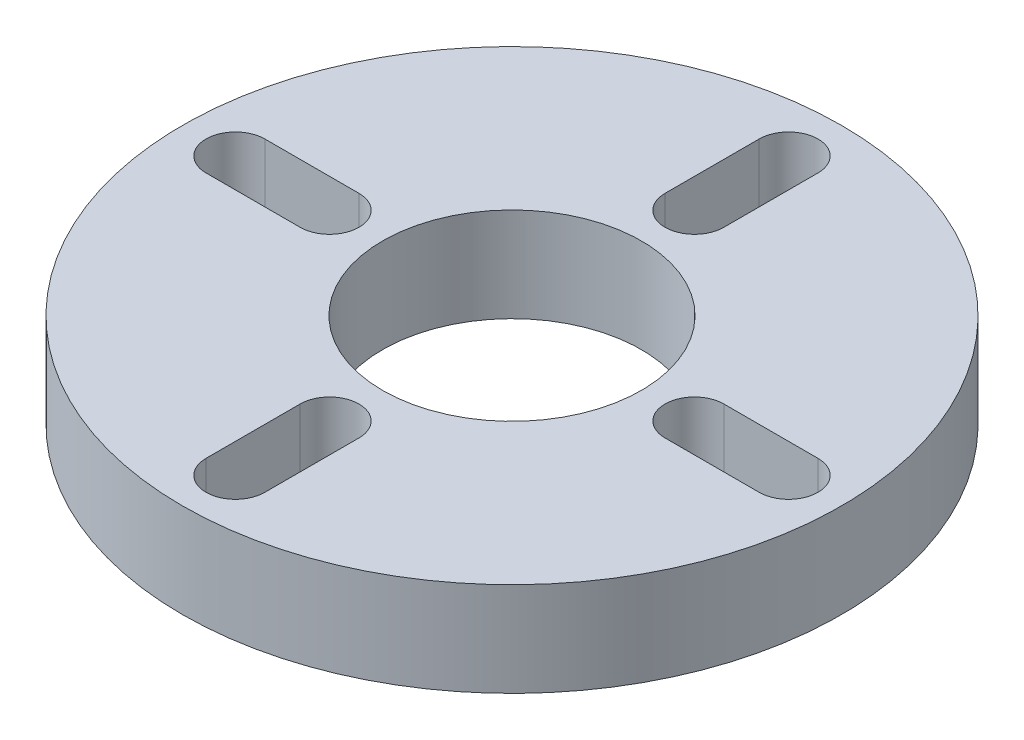
ISO-10303-21;
HEADER;
FILE_DESCRIPTION(('STEP AP214'),'2;1');
FILE_NAME('part.step','',(''),(''),'','','');
FILE_SCHEMA(('AUTOMOTIVE_DESIGN { 1 0 10303 214 1 1 1 1 }'));
ENDSEC;
DATA;
#1=APPLICATION_CONTEXT('core data for automotive mechanical design processes');
#2=APPLICATION_PROTOCOL_DEFINITION('international standard','automotive_design',2000,#1);
#3=PRODUCT_CONTEXT('',#1,'mechanical');
#4=PRODUCT('Part','Part','',(#3));
#5=PRODUCT_RELATED_PRODUCT_CATEGORY('part','',(#4));
#6=PRODUCT_DEFINITION_FORMATION('','',#4);
#7=PRODUCT_DEFINITION_CONTEXT('part definition',#1,'design');
#8=PRODUCT_DEFINITION('design','',#6,#7);
#9=PRODUCT_DEFINITION_SHAPE('','',#8);
#10=(LENGTH_UNIT() NAMED_UNIT(*) SI_UNIT(.MILLI.,.METRE.));
#11=(NAMED_UNIT(*) PLANE_ANGLE_UNIT() SI_UNIT($,.RADIAN.));
#12=(NAMED_UNIT(*) SI_UNIT($,.STERADIAN.) SOLID_ANGLE_UNIT());
#13=UNCERTAINTY_MEASURE_WITH_UNIT(LENGTH_MEASURE(1.E-05),#10,'distance_accuracy_value','');
#14=(GEOMETRIC_REPRESENTATION_CONTEXT(3) GLOBAL_UNCERTAINTY_ASSIGNED_CONTEXT((#13)) GLOBAL_UNIT_ASSIGNED_CONTEXT((#10,
#11,#12)) REPRESENTATION_CONTEXT('',''));
#15=CARTESIAN_POINT('',(0.,0.,0.));
#16=DIRECTION('',(0.,0.,1.));
#17=DIRECTION('',(1.,0.,0.));
#18=AXIS2_PLACEMENT_3D('',#15,#16,#17);
#19=CARTESIAN_POINT('',(0.,4.,0.));
#20=DIRECTION('',(0.,-1.,0.));
#21=DIRECTION('',(0.,0.,-1.));
#22=AXIS2_PLACEMENT_3D('',#19,#20,#21);
#23=CYLINDRICAL_SURFACE('',#22,14.);
#24=CARTESIAN_POINT('',(0.,4.,0.));
#25=DIRECTION('',(0.,1.,0.));
#26=DIRECTION('',(0.,0.,1.));
#27=AXIS2_PLACEMENT_3D('',#24,#25,#26);
#28=CIRCLE('',#27,14.);
#29=CARTESIAN_POINT('',(0.,4.,14.));
#30=VERTEX_POINT('',#29);
#31=EDGE_CURVE('E11',#30,#30,#28,.T.);
#32=ORIENTED_EDGE('',*,*,#31,.F.);
#33=EDGE_LOOP('',(#32));
#34=FACE_BOUND('',#33,.T.);
#35=CARTESIAN_POINT('',(0.,0.,0.));
#36=DIRECTION('',(0.,1.,0.));
#37=DIRECTION('',(0.,0.,1.));
#38=AXIS2_PLACEMENT_3D('',#35,#36,#37);
#39=CIRCLE('',#38,14.);
#40=CARTESIAN_POINT('',(0.,0.,14.));
#41=VERTEX_POINT('',#40);
#42=EDGE_CURVE('E36',#41,#41,#39,.T.);
#43=ORIENTED_EDGE('',*,*,#42,.T.);
#44=EDGE_LOOP('',(#43));
#45=FACE_BOUND('',#44,.T.);
#46=ADVANCED_FACE('F33',(#34,#45),#23,.T.);
#47=CARTESIAN_POINT('',(0.,4.,0.));
#48=DIRECTION('',(0.,1.,0.));
#49=DIRECTION('',(0.,0.,1.));
#50=AXIS2_PLACEMENT_3D('',#47,#48,#49);
#51=PLANE('',#50);
#52=CARTESIAN_POINT('',(-11.75,4.,0.));
#53=DIRECTION('',(0.,1.,0.));
#54=DIRECTION('',(0.,0.,1.));
#55=AXIS2_PLACEMENT_3D('',#52,#53,#54);
#56=CIRCLE('',#55,1.25);
#57=CARTESIAN_POINT('',(-11.75,4.,-1.25));
#58=VERTEX_POINT('',#57);
#59=CARTESIAN_POINT('',(-11.75,4.,1.25));
#60=VERTEX_POINT('',#59);
#61=EDGE_CURVE('E47',#58,#60,#56,.T.);
#62=ORIENTED_EDGE('',*,*,#61,.F.);
#63=DIRECTION('',(-1.,0.,0.));
#64=VECTOR('',#63,1.);
#65=CARTESIAN_POINT('',(-11.75,4.,-1.25));
#66=LINE('',#65,#64);
#67=CARTESIAN_POINT('',(-7.75,4.,-1.25));
#68=VERTEX_POINT('',#67);
#69=EDGE_CURVE('E166',#68,#58,#66,.T.);
#70=ORIENTED_EDGE('',*,*,#69,.F.);
#71=CARTESIAN_POINT('',(-7.75,4.,0.));
#72=DIRECTION('',(0.,1.,0.));
#73=DIRECTION('',(0.,0.,1.));
#74=AXIS2_PLACEMENT_3D('',#71,#72,#73);
#75=CIRCLE('',#74,1.25);
#76=CARTESIAN_POINT('',(-7.75,4.,1.25));
#77=VERTEX_POINT('',#76);
#78=EDGE_CURVE('E169',#77,#68,#75,.T.);
#79=ORIENTED_EDGE('',*,*,#78,.F.);
#80=DIRECTION('',(1.,0.,0.));
#81=VECTOR('',#80,1.);
#82=CARTESIAN_POINT('',(-11.75,4.,1.25));
#83=LINE('',#82,#81);
#84=EDGE_CURVE('E175',#60,#77,#83,.T.);
#85=ORIENTED_EDGE('',*,*,#84,.F.);
#86=EDGE_LOOP('',(#62,#70,#79,#85));
#87=FACE_BOUND('',#86,.T.);
#88=CARTESIAN_POINT('',(0.,4.,-11.75));
#89=DIRECTION('',(0.,1.,0.));
#90=DIRECTION('',(0.,0.,1.));
#91=AXIS2_PLACEMENT_3D('',#88,#89,#90);
#92=CIRCLE('',#91,1.25);
#93=CARTESIAN_POINT('',(1.25000000000004,4.,-11.75));
#94=VERTEX_POINT('',#93);
#95=CARTESIAN_POINT('',(-1.24999999999996,4.,-11.75));
#96=VERTEX_POINT('',#95);
#97=EDGE_CURVE('E55',#94,#96,#92,.T.);
#98=ORIENTED_EDGE('',*,*,#97,.F.);
#99=DIRECTION('',(0.,0.,-1.));
#100=VECTOR('',#99,1.);
#101=CARTESIAN_POINT('',(1.25000000000004,4.,-11.75));
#102=LINE('',#101,#100);
#103=CARTESIAN_POINT('',(1.25000000000003,4.,-7.75));
#104=VERTEX_POINT('',#103);
#105=EDGE_CURVE('E190',#104,#94,#102,.T.);
#106=ORIENTED_EDGE('',*,*,#105,.F.);
#107=CARTESIAN_POINT('',(0.,4.,-7.75));
#108=DIRECTION('',(0.,1.,0.));
#109=DIRECTION('',(0.,0.,1.));
#110=AXIS2_PLACEMENT_3D('',#107,#108,#109);
#111=CIRCLE('',#110,1.25);
#112=CARTESIAN_POINT('',(-1.24999999999997,4.,-7.75));
#113=VERTEX_POINT('',#112);
#114=EDGE_CURVE('E205',#113,#104,#111,.T.);
#115=ORIENTED_EDGE('',*,*,#114,.F.);
#116=DIRECTION('',(0.,0.,1.));
#117=VECTOR('',#116,1.);
#118=CARTESIAN_POINT('',(-1.24999999999996,4.,-11.75));
#119=LINE('',#118,#117);
#120=EDGE_CURVE('E201',#96,#113,#119,.T.);
#121=ORIENTED_EDGE('',*,*,#120,.F.);
#122=EDGE_LOOP('',(#98,#106,#115,#121));
#123=FACE_BOUND('',#122,.T.);
#124=CARTESIAN_POINT('',(11.75,4.,0.));
#125=DIRECTION('',(0.,1.,0.));
#126=DIRECTION('',(0.,0.,1.));
#127=AXIS2_PLACEMENT_3D('',#124,#125,#126);
#128=CIRCLE('',#127,1.25);
#129=CARTESIAN_POINT('',(11.75,4.,1.25000000000008));
#130=VERTEX_POINT('',#129);
#131=CARTESIAN_POINT('',(11.75,4.,-1.24999999999992));
#132=VERTEX_POINT('',#131);
#133=EDGE_CURVE('E230',#130,#132,#128,.T.);
#134=ORIENTED_EDGE('',*,*,#133,.F.);
#135=DIRECTION('',(1.,0.,0.));
#136=VECTOR('',#135,1.);
#137=CARTESIAN_POINT('',(11.75,4.,1.25000000000008));
#138=LINE('',#137,#136);
#139=CARTESIAN_POINT('',(7.74999999999999,4.,1.25000000000006));
#140=VERTEX_POINT('',#139);
#141=EDGE_CURVE('E220',#140,#130,#138,.T.);
#142=ORIENTED_EDGE('',*,*,#141,.F.);
#143=CARTESIAN_POINT('',(7.75,4.,0.));
#144=DIRECTION('',(0.,1.,0.));
#145=DIRECTION('',(0.,0.,1.));
#146=AXIS2_PLACEMENT_3D('',#143,#144,#145);
#147=CIRCLE('',#146,1.25);
#148=CARTESIAN_POINT('',(7.75000000000001,4.,-1.24999999999995));
#149=VERTEX_POINT('',#148);
#150=EDGE_CURVE('E236',#149,#140,#147,.T.);
#151=ORIENTED_EDGE('',*,*,#150,.F.);
#152=DIRECTION('',(-1.,0.,0.));
#153=VECTOR('',#152,1.);
#154=CARTESIAN_POINT('',(11.75,4.,-1.24999999999992));
#155=LINE('',#154,#153);
#156=EDGE_CURVE('E232',#132,#149,#155,.T.);
#157=ORIENTED_EDGE('',*,*,#156,.F.);
#158=EDGE_LOOP('',(#134,#142,#151,#157));
#159=FACE_BOUND('',#158,.T.);
#160=CARTESIAN_POINT('',(-1.22207355456232E-13,4.,11.75));
#161=DIRECTION('',(0.,1.,0.));
#162=DIRECTION('',(0.,0.,1.));
#163=AXIS2_PLACEMENT_3D('',#160,#161,#162);
#164=CIRCLE('',#163,1.25);
#165=CARTESIAN_POINT('',(-1.25000000000012,4.,11.75));
#166=VERTEX_POINT('',#165);
#167=CARTESIAN_POINT('',(1.24999999999988,4.,11.75));
#168=VERTEX_POINT('',#167);
#169=EDGE_CURVE('E262',#166,#168,#164,.T.);
#170=ORIENTED_EDGE('',*,*,#169,.F.);
#171=DIRECTION('',(0.,0.,1.));
#172=VECTOR('',#171,1.);
#173=CARTESIAN_POINT('',(-1.25000000000012,4.,11.75));
#174=LINE('',#173,#172);
#175=CARTESIAN_POINT('',(-1.25000000000008,4.,7.74999999999999));
#176=VERTEX_POINT('',#175);
#177=EDGE_CURVE('E252',#176,#166,#174,.T.);
#178=ORIENTED_EDGE('',*,*,#177,.F.);
#179=CARTESIAN_POINT('',(0.,4.,7.75));
#180=DIRECTION('',(0.,1.,0.));
#181=DIRECTION('',(0.,0.,1.));
#182=AXIS2_PLACEMENT_3D('',#179,#180,#181);
#183=CIRCLE('',#182,1.25);
#184=CARTESIAN_POINT('',(1.24999999999992,4.,7.75000000000001));
#185=VERTEX_POINT('',#184);
#186=EDGE_CURVE('E267',#185,#176,#183,.T.);
#187=ORIENTED_EDGE('',*,*,#186,.F.);
#188=DIRECTION('',(0.,0.,-1.));
#189=VECTOR('',#188,1.);
#190=CARTESIAN_POINT('',(1.24999999999988,4.,11.75));
#191=LINE('',#190,#189);
#192=EDGE_CURVE('E264',#168,#185,#191,.T.);
#193=ORIENTED_EDGE('',*,*,#192,.F.);
#194=EDGE_LOOP('',(#170,#178,#187,#193));
#195=FACE_BOUND('',#194,.T.);
#196=CARTESIAN_POINT('',(0.,4.,0.));
#197=DIRECTION('',(0.,1.,0.));
#198=DIRECTION('',(0.,0.,1.));
#199=AXIS2_PLACEMENT_3D('',#196,#197,#198);
#200=CIRCLE('',#199,5.5);
#201=CARTESIAN_POINT('',(0.,4.,5.5));
#202=VERTEX_POINT('',#201);
#203=EDGE_CURVE('E182',#202,#202,#200,.T.);
#204=ORIENTED_EDGE('',*,*,#203,.F.);
#205=EDGE_LOOP('',(#204));
#206=FACE_BOUND('',#205,.T.);
#207=ORIENTED_EDGE('',*,*,#31,.T.);
#208=EDGE_LOOP('',(#207));
#209=FACE_BOUND('',#208,.T.);
#210=ADVANCED_FACE('F287',(#87,#123,#159,#195,#206,#209),#51,.T.);
#211=CARTESIAN_POINT('',(0.,0.,0.));
#212=DIRECTION('',(0.,1.,0.));
#213=DIRECTION('',(0.,0.,1.));
#214=AXIS2_PLACEMENT_3D('',#211,#212,#213);
#215=PLANE('',#214);
#216=DIRECTION('',(-1.,0.,0.));
#217=VECTOR('',#216,1.);
#218=CARTESIAN_POINT('',(-11.75,0.,-1.25));
#219=LINE('',#218,#217);
#220=CARTESIAN_POINT('',(-7.75,0.,-1.25));
#221=VERTEX_POINT('',#220);
#222=CARTESIAN_POINT('',(-11.75,0.,-1.25));
#223=VERTEX_POINT('',#222);
#224=EDGE_CURVE('E153',#221,#223,#219,.T.);
#225=ORIENTED_EDGE('',*,*,#224,.T.);
#226=CARTESIAN_POINT('',(-11.75,0.,0.));
#227=DIRECTION('',(0.,1.,0.));
#228=DIRECTION('',(0.,0.,1.));
#229=AXIS2_PLACEMENT_3D('',#226,#227,#228);
#230=CIRCLE('',#229,1.25);
#231=CARTESIAN_POINT('',(-11.75,0.,1.25));
#232=VERTEX_POINT('',#231);
#233=EDGE_CURVE('E147',#223,#232,#230,.T.);
#234=ORIENTED_EDGE('',*,*,#233,.T.);
#235=DIRECTION('',(1.,0.,0.));
#236=VECTOR('',#235,1.);
#237=CARTESIAN_POINT('',(-11.75,0.,1.25));
#238=LINE('',#237,#236);
#239=CARTESIAN_POINT('',(-7.75,0.,1.25));
#240=VERTEX_POINT('',#239);
#241=EDGE_CURVE('E157',#232,#240,#238,.T.);
#242=ORIENTED_EDGE('',*,*,#241,.T.);
#243=CARTESIAN_POINT('',(-7.75,0.,0.));
#244=DIRECTION('',(0.,1.,0.));
#245=DIRECTION('',(0.,0.,1.));
#246=AXIS2_PLACEMENT_3D('',#243,#244,#245);
#247=CIRCLE('',#246,1.25);
#248=EDGE_CURVE('E161',#240,#221,#247,.T.);
#249=ORIENTED_EDGE('',*,*,#248,.T.);
#250=EDGE_LOOP('',(#225,#234,#242,#249));
#251=FACE_BOUND('',#250,.T.);
#252=DIRECTION('',(0.,0.,-1.));
#253=VECTOR('',#252,1.);
#254=CARTESIAN_POINT('',(1.25000000000004,0.,-11.75));
#255=LINE('',#254,#253);
#256=CARTESIAN_POINT('',(1.25000000000003,0.,-7.75));
#257=VERTEX_POINT('',#256);
#258=CARTESIAN_POINT('',(1.25000000000004,0.,-11.75));
#259=VERTEX_POINT('',#258);
#260=EDGE_CURVE('E196',#257,#259,#255,.T.);
#261=ORIENTED_EDGE('',*,*,#260,.T.);
#262=CARTESIAN_POINT('',(0.,0.,-11.75));
#263=DIRECTION('',(0.,1.,0.));
#264=DIRECTION('',(0.,0.,1.));
#265=AXIS2_PLACEMENT_3D('',#262,#263,#264);
#266=CIRCLE('',#265,1.25);
#267=CARTESIAN_POINT('',(-1.24999999999996,0.,-11.75));
#268=VERTEX_POINT('',#267);
#269=EDGE_CURVE('E186',#259,#268,#266,.T.);
#270=ORIENTED_EDGE('',*,*,#269,.T.);
#271=DIRECTION('',(0.,0.,1.));
#272=VECTOR('',#271,1.);
#273=CARTESIAN_POINT('',(-1.24999999999996,0.,-11.75));
#274=LINE('',#273,#272);
#275=CARTESIAN_POINT('',(-1.24999999999997,0.,-7.75));
#276=VERTEX_POINT('',#275);
#277=EDGE_CURVE('E189',#268,#276,#274,.T.);
#278=ORIENTED_EDGE('',*,*,#277,.T.);
#279=CARTESIAN_POINT('',(0.,0.,-7.75));
#280=DIRECTION('',(0.,1.,0.));
#281=DIRECTION('',(0.,0.,1.));
#282=AXIS2_PLACEMENT_3D('',#279,#280,#281);
#283=CIRCLE('',#282,1.25);
#284=EDGE_CURVE('E193',#276,#257,#283,.T.);
#285=ORIENTED_EDGE('',*,*,#284,.T.);
#286=EDGE_LOOP('',(#261,#270,#278,#285));
#287=FACE_BOUND('',#286,.T.);
#288=DIRECTION('',(1.,0.,0.));
#289=VECTOR('',#288,1.);
#290=CARTESIAN_POINT('',(11.75,0.,1.25000000000008));
#291=LINE('',#290,#289);
#292=CARTESIAN_POINT('',(7.74999999999999,0.,1.25000000000006));
#293=VERTEX_POINT('',#292);
#294=CARTESIAN_POINT('',(11.75,0.,1.25000000000008));
#295=VERTEX_POINT('',#294);
#296=EDGE_CURVE('E226',#293,#295,#291,.T.);
#297=ORIENTED_EDGE('',*,*,#296,.T.);
#298=CARTESIAN_POINT('',(11.75,0.,0.));
#299=DIRECTION('',(0.,1.,0.));
#300=DIRECTION('',(0.,0.,1.));
#301=AXIS2_PLACEMENT_3D('',#298,#299,#300);
#302=CIRCLE('',#301,1.25);
#303=CARTESIAN_POINT('',(11.75,0.,-1.24999999999992));
#304=VERTEX_POINT('',#303);
#305=EDGE_CURVE('E216',#295,#304,#302,.T.);
#306=ORIENTED_EDGE('',*,*,#305,.T.);
#307=DIRECTION('',(-1.,0.,0.));
#308=VECTOR('',#307,1.);
#309=CARTESIAN_POINT('',(11.75,0.,-1.24999999999992));
#310=LINE('',#309,#308);
#311=CARTESIAN_POINT('',(7.75000000000001,0.,-1.24999999999995));
#312=VERTEX_POINT('',#311);
#313=EDGE_CURVE('E219',#304,#312,#310,.T.);
#314=ORIENTED_EDGE('',*,*,#313,.T.);
#315=CARTESIAN_POINT('',(7.75,0.,0.));
#316=DIRECTION('',(0.,1.,0.));
#317=DIRECTION('',(0.,0.,1.));
#318=AXIS2_PLACEMENT_3D('',#315,#316,#317);
#319=CIRCLE('',#318,1.25);
#320=EDGE_CURVE('E223',#312,#293,#319,.T.);
#321=ORIENTED_EDGE('',*,*,#320,.T.);
#322=EDGE_LOOP('',(#297,#306,#314,#321));
#323=FACE_BOUND('',#322,.T.);
#324=DIRECTION('',(0.,0.,1.));
#325=VECTOR('',#324,1.);
#326=CARTESIAN_POINT('',(-1.25000000000012,0.,11.75));
#327=LINE('',#326,#325);
#328=CARTESIAN_POINT('',(-1.25000000000008,0.,7.74999999999999));
#329=VERTEX_POINT('',#328);
#330=CARTESIAN_POINT('',(-1.25000000000012,0.,11.75));
#331=VERTEX_POINT('',#330);
#332=EDGE_CURVE('E258',#329,#331,#327,.T.);
#333=ORIENTED_EDGE('',*,*,#332,.T.);
#334=CARTESIAN_POINT('',(-1.22207355456232E-13,0.,11.75));
#335=DIRECTION('',(0.,1.,0.));
#336=DIRECTION('',(0.,0.,1.));
#337=AXIS2_PLACEMENT_3D('',#334,#335,#336);
#338=CIRCLE('',#337,1.25);
#339=CARTESIAN_POINT('',(1.24999999999988,0.,11.75));
#340=VERTEX_POINT('',#339);
#341=EDGE_CURVE('E248',#331,#340,#338,.T.);
#342=ORIENTED_EDGE('',*,*,#341,.T.);
#343=DIRECTION('',(0.,0.,-1.));
#344=VECTOR('',#343,1.);
#345=CARTESIAN_POINT('',(1.24999999999988,0.,11.75));
#346=LINE('',#345,#344);
#347=CARTESIAN_POINT('',(1.24999999999992,0.,7.75000000000001));
#348=VERTEX_POINT('',#347);
#349=EDGE_CURVE('E251',#340,#348,#346,.T.);
#350=ORIENTED_EDGE('',*,*,#349,.T.);
#351=CARTESIAN_POINT('',(0.,0.,7.75));
#352=DIRECTION('',(0.,1.,0.));
#353=DIRECTION('',(0.,0.,1.));
#354=AXIS2_PLACEMENT_3D('',#351,#352,#353);
#355=CIRCLE('',#354,1.25);
#356=EDGE_CURVE('E255',#348,#329,#355,.T.);
#357=ORIENTED_EDGE('',*,*,#356,.T.);
#358=EDGE_LOOP('',(#333,#342,#350,#357));
#359=FACE_BOUND('',#358,.T.);
#360=CARTESIAN_POINT('',(0.,0.,0.));
#361=DIRECTION('',(0.,1.,0.));
#362=DIRECTION('',(0.,0.,1.));
#363=AXIS2_PLACEMENT_3D('',#360,#361,#362);
#364=CIRCLE('',#363,5.5);
#365=CARTESIAN_POINT('',(0.,0.,5.5));
#366=VERTEX_POINT('',#365);
#367=EDGE_CURVE('E279',#366,#366,#364,.T.);
#368=ORIENTED_EDGE('',*,*,#367,.T.);
#369=EDGE_LOOP('',(#368));
#370=FACE_BOUND('',#369,.T.);
#371=ORIENTED_EDGE('',*,*,#42,.F.);
#372=EDGE_LOOP('',(#371));
#373=FACE_BOUND('',#372,.T.);
#374=ADVANCED_FACE('F163',(#251,#287,#323,#359,#370,#373),#215,.F.);
#375=CARTESIAN_POINT('',(0.,0.,0.));
#376=DIRECTION('',(0.,1.,0.));
#377=DIRECTION('',(0.,0.,1.));
#378=AXIS2_PLACEMENT_3D('',#375,#376,#377);
#379=CYLINDRICAL_SURFACE('',#378,5.5);
#380=ORIENTED_EDGE('',*,*,#367,.F.);
#381=EDGE_LOOP('',(#380));
#382=FACE_BOUND('',#381,.T.);
#383=ORIENTED_EDGE('',*,*,#203,.T.);
#384=EDGE_LOOP('',(#383));
#385=FACE_BOUND('',#384,.T.);
#386=ADVANCED_FACE('F285',(#382,#385),#379,.F.);
#387=CARTESIAN_POINT('',(-1.22207355456232E-13,0.,11.75));
#388=DIRECTION('',(0.,1.,0.));
#389=DIRECTION('',(0.,0.,1.));
#390=AXIS2_PLACEMENT_3D('',#387,#388,#389);
#391=CYLINDRICAL_SURFACE('',#390,1.25);
#392=ORIENTED_EDGE('',*,*,#169,.T.);
#393=DIRECTION('',(0.,1.,0.));
#394=VECTOR('',#393,1.);
#395=CARTESIAN_POINT('',(1.24999999999988,0.,11.75));
#396=LINE('',#395,#394);
#397=EDGE_CURVE('E261',#340,#168,#396,.T.);
#398=ORIENTED_EDGE('',*,*,#397,.F.);
#399=ORIENTED_EDGE('',*,*,#341,.F.);
#400=DIRECTION('',(0.,1.,0.));
#401=VECTOR('',#400,1.);
#402=CARTESIAN_POINT('',(-1.25000000000012,0.,11.75));
#403=LINE('',#402,#401);
#404=EDGE_CURVE('E233',#331,#166,#403,.T.);
#405=ORIENTED_EDGE('',*,*,#404,.T.);
#406=EDGE_LOOP('',(#392,#398,#399,#405));
#407=FACE_BOUND('',#406,.T.);
#408=ADVANCED_FACE('F303',(#407),#391,.F.);
#409=CARTESIAN_POINT('',(-1.25000000000012,0.,11.75));
#410=DIRECTION('',(-1.,0.,0.));
#411=DIRECTION('',(0.,0.,1.));
#412=AXIS2_PLACEMENT_3D('',#409,#410,#411);
#413=PLANE('',#412);
#414=ORIENTED_EDGE('',*,*,#177,.T.);
#415=ORIENTED_EDGE('',*,*,#404,.F.);
#416=ORIENTED_EDGE('',*,*,#332,.F.);
#417=DIRECTION('',(0.,1.,0.));
#418=VECTOR('',#417,1.);
#419=CARTESIAN_POINT('',(-1.25000000000008,0.,7.74999999999999));
#420=LINE('',#419,#418);
#421=EDGE_CURVE('E273',#329,#176,#420,.T.);
#422=ORIENTED_EDGE('',*,*,#421,.T.);
#423=EDGE_LOOP('',(#414,#415,#416,#422));
#424=FACE_BOUND('',#423,.T.);
#425=ADVANCED_FACE('F309',(#424),#413,.F.);
#426=CARTESIAN_POINT('',(0.,0.,7.75));
#427=DIRECTION('',(0.,1.,0.));
#428=DIRECTION('',(0.,0.,1.));
#429=AXIS2_PLACEMENT_3D('',#426,#427,#428);
#430=CYLINDRICAL_SURFACE('',#429,1.25);
#431=ORIENTED_EDGE('',*,*,#186,.T.);
#432=ORIENTED_EDGE('',*,*,#421,.F.);
#433=ORIENTED_EDGE('',*,*,#356,.F.);
#434=DIRECTION('',(0.,1.,0.));
#435=VECTOR('',#434,1.);
#436=CARTESIAN_POINT('',(1.24999999999992,0.,7.75000000000001));
#437=LINE('',#436,#435);
#438=EDGE_CURVE('E275',#348,#185,#437,.T.);
#439=ORIENTED_EDGE('',*,*,#438,.T.);
#440=EDGE_LOOP('',(#431,#432,#433,#439));
#441=FACE_BOUND('',#440,.T.);
#442=ADVANCED_FACE('F315',(#441),#430,.F.);
#443=CARTESIAN_POINT('',(1.24999999999988,0.,11.75));
#444=DIRECTION('',(1.,0.,0.));
#445=DIRECTION('',(0.,0.,-1.));
#446=AXIS2_PLACEMENT_3D('',#443,#444,#445);
#447=PLANE('',#446);
#448=ORIENTED_EDGE('',*,*,#192,.T.);
#449=ORIENTED_EDGE('',*,*,#438,.F.);
#450=ORIENTED_EDGE('',*,*,#349,.F.);
#451=ORIENTED_EDGE('',*,*,#397,.T.);
#452=EDGE_LOOP('',(#448,#449,#450,#451));
#453=FACE_BOUND('',#452,.T.);
#454=ADVANCED_FACE('F311',(#453),#447,.F.);
#455=CARTESIAN_POINT('',(11.75,0.,0.));
#456=DIRECTION('',(0.,1.,0.));
#457=DIRECTION('',(0.,0.,1.));
#458=AXIS2_PLACEMENT_3D('',#455,#456,#457);
#459=CYLINDRICAL_SURFACE('',#458,1.25);
#460=ORIENTED_EDGE('',*,*,#133,.T.);
#461=DIRECTION('',(0.,1.,0.));
#462=VECTOR('',#461,1.);
#463=CARTESIAN_POINT('',(11.75,0.,-1.24999999999992));
#464=LINE('',#463,#462);
#465=EDGE_CURVE('E229',#304,#132,#464,.T.);
#466=ORIENTED_EDGE('',*,*,#465,.F.);
#467=ORIENTED_EDGE('',*,*,#305,.F.);
#468=DIRECTION('',(0.,1.,0.));
#469=VECTOR('',#468,1.);
#470=CARTESIAN_POINT('',(11.75,0.,1.25000000000008));
#471=LINE('',#470,#469);
#472=EDGE_CURVE('E202',#295,#130,#471,.T.);
#473=ORIENTED_EDGE('',*,*,#472,.T.);
#474=EDGE_LOOP('',(#460,#466,#467,#473));
#475=FACE_BOUND('',#474,.T.);
#476=ADVANCED_FACE('F314',(#475),#459,.F.);
#477=CARTESIAN_POINT('',(11.75,0.,1.25000000000008));
#478=DIRECTION('',(0.,0.,1.));
#479=DIRECTION('',(1.,0.,0.));
#480=AXIS2_PLACEMENT_3D('',#477,#478,#479);
#481=PLANE('',#480);
#482=ORIENTED_EDGE('',*,*,#141,.T.);
#483=ORIENTED_EDGE('',*,*,#472,.F.);
#484=ORIENTED_EDGE('',*,*,#296,.F.);
#485=DIRECTION('',(0.,1.,0.));
#486=VECTOR('',#485,1.);
#487=CARTESIAN_POINT('',(7.74999999999999,0.,1.25000000000006));
#488=LINE('',#487,#486);
#489=EDGE_CURVE('E242',#293,#140,#488,.T.);
#490=ORIENTED_EDGE('',*,*,#489,.T.);
#491=EDGE_LOOP('',(#482,#483,#484,#490));
#492=FACE_BOUND('',#491,.T.);
#493=ADVANCED_FACE('F325',(#492),#481,.F.);
#494=CARTESIAN_POINT('',(7.75,0.,0.));
#495=DIRECTION('',(0.,1.,0.));
#496=DIRECTION('',(0.,0.,1.));
#497=AXIS2_PLACEMENT_3D('',#494,#495,#496);
#498=CYLINDRICAL_SURFACE('',#497,1.25);
#499=ORIENTED_EDGE('',*,*,#150,.T.);
#500=ORIENTED_EDGE('',*,*,#489,.F.);
#501=ORIENTED_EDGE('',*,*,#320,.F.);
#502=DIRECTION('',(0.,1.,0.));
#503=VECTOR('',#502,1.);
#504=CARTESIAN_POINT('',(7.75000000000001,0.,-1.24999999999995));
#505=LINE('',#504,#503);
#506=EDGE_CURVE('E244',#312,#149,#505,.T.);
#507=ORIENTED_EDGE('',*,*,#506,.T.);
#508=EDGE_LOOP('',(#499,#500,#501,#507));
#509=FACE_BOUND('',#508,.T.);
#510=ADVANCED_FACE('F331',(#509),#498,.F.);
#511=CARTESIAN_POINT('',(11.75,0.,-1.24999999999992));
#512=DIRECTION('',(0.,0.,-1.));
#513=DIRECTION('',(-1.,0.,0.));
#514=AXIS2_PLACEMENT_3D('',#511,#512,#513);
#515=PLANE('',#514);
#516=ORIENTED_EDGE('',*,*,#156,.T.);
#517=ORIENTED_EDGE('',*,*,#506,.F.);
#518=ORIENTED_EDGE('',*,*,#313,.F.);
#519=ORIENTED_EDGE('',*,*,#465,.T.);
#520=EDGE_LOOP('',(#516,#517,#518,#519));
#521=FACE_BOUND('',#520,.T.);
#522=ADVANCED_FACE('F327',(#521),#515,.F.);
#523=CARTESIAN_POINT('',(0.,0.,-11.75));
#524=DIRECTION('',(0.,1.,0.));
#525=DIRECTION('',(0.,0.,1.));
#526=AXIS2_PLACEMENT_3D('',#523,#524,#525);
#527=CYLINDRICAL_SURFACE('',#526,1.25);
#528=ORIENTED_EDGE('',*,*,#97,.T.);
#529=DIRECTION('',(0.,1.,0.));
#530=VECTOR('',#529,1.);
#531=CARTESIAN_POINT('',(-1.24999999999996,0.,-11.75));
#532=LINE('',#531,#530);
#533=EDGE_CURVE('E199',#268,#96,#532,.T.);
#534=ORIENTED_EDGE('',*,*,#533,.F.);
#535=ORIENTED_EDGE('',*,*,#269,.F.);
#536=DIRECTION('',(0.,1.,0.));
#537=VECTOR('',#536,1.);
#538=CARTESIAN_POINT('',(1.25000000000004,0.,-11.75));
#539=LINE('',#538,#537);
#540=EDGE_CURVE('E176',#259,#94,#539,.T.);
#541=ORIENTED_EDGE('',*,*,#540,.T.);
#542=EDGE_LOOP('',(#528,#534,#535,#541));
#543=FACE_BOUND('',#542,.T.);
#544=ADVANCED_FACE('F330',(#543),#527,.F.);
#545=CARTESIAN_POINT('',(1.25000000000004,0.,-11.75));
#546=DIRECTION('',(1.,0.,0.));
#547=DIRECTION('',(0.,0.,-1.));
#548=AXIS2_PLACEMENT_3D('',#545,#546,#547);
#549=PLANE('',#548);
#550=ORIENTED_EDGE('',*,*,#105,.T.);
#551=ORIENTED_EDGE('',*,*,#540,.F.);
#552=ORIENTED_EDGE('',*,*,#260,.F.);
#553=DIRECTION('',(0.,1.,0.));
#554=VECTOR('',#553,1.);
#555=CARTESIAN_POINT('',(1.25000000000003,0.,-7.75));
#556=LINE('',#555,#554);
#557=EDGE_CURVE('E211',#257,#104,#556,.T.);
#558=ORIENTED_EDGE('',*,*,#557,.T.);
#559=EDGE_LOOP('',(#550,#551,#552,#558));
#560=FACE_BOUND('',#559,.T.);
#561=ADVANCED_FACE('F341',(#560),#549,.F.);
#562=CARTESIAN_POINT('',(0.,0.,-7.75));
#563=DIRECTION('',(0.,1.,0.));
#564=DIRECTION('',(0.,0.,1.));
#565=AXIS2_PLACEMENT_3D('',#562,#563,#564);
#566=CYLINDRICAL_SURFACE('',#565,1.25);
#567=ORIENTED_EDGE('',*,*,#114,.T.);
#568=ORIENTED_EDGE('',*,*,#557,.F.);
#569=ORIENTED_EDGE('',*,*,#284,.F.);
#570=DIRECTION('',(0.,1.,0.));
#571=VECTOR('',#570,1.);
#572=CARTESIAN_POINT('',(-1.24999999999997,0.,-7.75));
#573=LINE('',#572,#571);
#574=EDGE_CURVE('E213',#276,#113,#573,.T.);
#575=ORIENTED_EDGE('',*,*,#574,.T.);
#576=EDGE_LOOP('',(#567,#568,#569,#575));
#577=FACE_BOUND('',#576,.T.);
#578=ADVANCED_FACE('F345',(#577),#566,.F.);
#579=CARTESIAN_POINT('',(-1.24999999999996,0.,-11.75));
#580=DIRECTION('',(-1.,0.,0.));
#581=DIRECTION('',(0.,0.,1.));
#582=AXIS2_PLACEMENT_3D('',#579,#580,#581);
#583=PLANE('',#582);
#584=ORIENTED_EDGE('',*,*,#120,.T.);
#585=ORIENTED_EDGE('',*,*,#574,.F.);
#586=ORIENTED_EDGE('',*,*,#277,.F.);
#587=ORIENTED_EDGE('',*,*,#533,.T.);
#588=EDGE_LOOP('',(#584,#585,#586,#587));
#589=FACE_BOUND('',#588,.T.);
#590=ADVANCED_FACE('F342',(#589),#583,.F.);
#591=CARTESIAN_POINT('',(-11.75,0.,0.));
#592=DIRECTION('',(0.,1.,0.));
#593=DIRECTION('',(0.,0.,1.));
#594=AXIS2_PLACEMENT_3D('',#591,#592,#593);
#595=CYLINDRICAL_SURFACE('',#594,1.25);
#596=ORIENTED_EDGE('',*,*,#61,.T.);
#597=DIRECTION('',(0.,1.,0.));
#598=VECTOR('',#597,1.);
#599=CARTESIAN_POINT('',(-11.75,0.,1.25));
#600=LINE('',#599,#598);
#601=EDGE_CURVE('E143',#232,#60,#600,.T.);
#602=ORIENTED_EDGE('',*,*,#601,.F.);
#603=ORIENTED_EDGE('',*,*,#233,.F.);
#604=DIRECTION('',(0.,1.,0.));
#605=VECTOR('',#604,1.);
#606=CARTESIAN_POINT('',(-11.75,0.,-1.25));
#607=LINE('',#606,#605);
#608=EDGE_CURVE('E180',#223,#58,#607,.T.);
#609=ORIENTED_EDGE('',*,*,#608,.T.);
#610=EDGE_LOOP('',(#596,#602,#603,#609));
#611=FACE_BOUND('',#610,.T.);
#612=ADVANCED_FACE('F145',(#611),#595,.F.);
#613=CARTESIAN_POINT('',(-11.75,0.,-1.25));
#614=DIRECTION('',(0.,0.,-1.));
#615=DIRECTION('',(-1.,0.,0.));
#616=AXIS2_PLACEMENT_3D('',#613,#614,#615);
#617=PLANE('',#616);
#618=ORIENTED_EDGE('',*,*,#69,.T.);
#619=ORIENTED_EDGE('',*,*,#608,.F.);
#620=ORIENTED_EDGE('',*,*,#224,.F.);
#621=DIRECTION('',(0.,1.,0.));
#622=VECTOR('',#621,1.);
#623=CARTESIAN_POINT('',(-7.75,0.,-1.25));
#624=LINE('',#623,#622);
#625=EDGE_CURVE('E183',#221,#68,#624,.T.);
#626=ORIENTED_EDGE('',*,*,#625,.T.);
#627=EDGE_LOOP('',(#618,#619,#620,#626));
#628=FACE_BOUND('',#627,.T.);
#629=ADVANCED_FACE('F355',(#628),#617,.F.);
#630=CARTESIAN_POINT('',(-7.75,0.,0.));
#631=DIRECTION('',(0.,1.,0.));
#632=DIRECTION('',(0.,0.,1.));
#633=AXIS2_PLACEMENT_3D('',#630,#631,#632);
#634=CYLINDRICAL_SURFACE('',#633,1.25);
#635=ORIENTED_EDGE('',*,*,#78,.T.);
#636=ORIENTED_EDGE('',*,*,#625,.F.);
#637=ORIENTED_EDGE('',*,*,#248,.F.);
#638=DIRECTION('',(0.,1.,0.));
#639=VECTOR('',#638,1.);
#640=CARTESIAN_POINT('',(-7.75,0.,1.25));
#641=LINE('',#640,#639);
#642=EDGE_CURVE('E152',#240,#77,#641,.T.);
#643=ORIENTED_EDGE('',*,*,#642,.T.);
#644=EDGE_LOOP('',(#635,#636,#637,#643));
#645=FACE_BOUND('',#644,.T.);
#646=ADVANCED_FACE('F358',(#645),#634,.F.);
#647=CARTESIAN_POINT('',(-11.75,0.,1.25));
#648=DIRECTION('',(0.,0.,1.));
#649=DIRECTION('',(1.,0.,0.));
#650=AXIS2_PLACEMENT_3D('',#647,#648,#649);
#651=PLANE('',#650);
#652=ORIENTED_EDGE('',*,*,#84,.T.);
#653=ORIENTED_EDGE('',*,*,#642,.F.);
#654=ORIENTED_EDGE('',*,*,#241,.F.);
#655=ORIENTED_EDGE('',*,*,#601,.T.);
#656=EDGE_LOOP('',(#652,#653,#654,#655));
#657=FACE_BOUND('',#656,.T.);
#658=ADVANCED_FACE('F158',(#657),#651,.F.);
#659=CLOSED_SHELL('',(#46,#210,#374,#386,#408,#425,#442,#454,#476,#493,#510,#522,#544,#561,#578,
#590,#612,#629,#646,#658));
#660=MANIFOLD_SOLID_BREP('B2',#659);
#661=ADVANCED_BREP_SHAPE_REPRESENTATION('',(#18,#660),#14);
#662=SHAPE_DEFINITION_REPRESENTATION(#9,#661);
ENDSEC;
END-ISO-10303-21;
